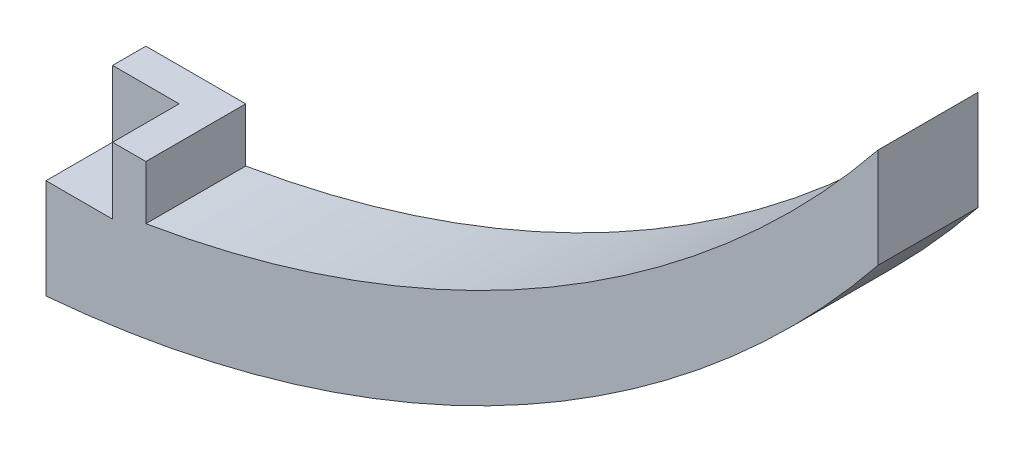
ISO-10303-21;
HEADER;
FILE_DESCRIPTION(('STEP AP214'),'2;1');
FILE_NAME('part.step','',(''),(''),'','','');
FILE_SCHEMA(('AUTOMOTIVE_DESIGN { 1 0 10303 214 1 1 1 1 }'));
ENDSEC;
DATA;
#1=APPLICATION_CONTEXT('core data for automotive mechanical design processes');
#2=APPLICATION_PROTOCOL_DEFINITION('international standard','automotive_design',2000,#1);
#3=PRODUCT_CONTEXT('',#1,'mechanical');
#4=PRODUCT('Part','Part','',(#3));
#5=PRODUCT_RELATED_PRODUCT_CATEGORY('part','',(#4));
#6=PRODUCT_DEFINITION_FORMATION('','',#4);
#7=PRODUCT_DEFINITION_CONTEXT('part definition',#1,'design');
#8=PRODUCT_DEFINITION('design','',#6,#7);
#9=PRODUCT_DEFINITION_SHAPE('','',#8);
#10=(LENGTH_UNIT() NAMED_UNIT(*) SI_UNIT(.MILLI.,.METRE.));
#11=(NAMED_UNIT(*) PLANE_ANGLE_UNIT() SI_UNIT($,.RADIAN.));
#12=(NAMED_UNIT(*) SI_UNIT($,.STERADIAN.) SOLID_ANGLE_UNIT());
#13=UNCERTAINTY_MEASURE_WITH_UNIT(LENGTH_MEASURE(1.E-05),#10,'distance_accuracy_value','');
#14=(GEOMETRIC_REPRESENTATION_CONTEXT(3) GLOBAL_UNCERTAINTY_ASSIGNED_CONTEXT((#13)) GLOBAL_UNIT_ASSIGNED_CONTEXT((#10,
#11,#12)) REPRESENTATION_CONTEXT('',''));
#15=CARTESIAN_POINT('',(0.,0.,0.));
#16=DIRECTION('',(0.,0.,1.));
#17=DIRECTION('',(1.,0.,0.));
#18=AXIS2_PLACEMENT_3D('',#15,#16,#17);
#19=CARTESIAN_POINT('',(-30.2937484008937,388.399250917739,30.));
#20=DIRECTION('',(0.,0.,1.));
#21=DIRECTION('',(-1.,0.,0.));
#22=AXIS2_PLACEMENT_3D('',#19,#20,#21);
#23=CYLINDRICAL_SURFACE('',#22,359.677264016747);
#24=DIRECTION('',(0.,0.,1.));
#25=VECTOR('',#24,1.);
#26=CARTESIAN_POINT('',(30.,33.8116056812716,29.9999999999999));
#27=LINE('',#26,#25);
#28=CARTESIAN_POINT('',(30.,33.8116056812716,30.));
#29=VERTEX_POINT('',#28);
#30=CARTESIAN_POINT('',(30.,33.8116056812717,60.));
#31=VERTEX_POINT('',#30);
#32=EDGE_CURVE('E118',#29,#31,#27,.T.);
#33=ORIENTED_EDGE('',*,*,#32,.T.);
#34=CARTESIAN_POINT('',(-30.2937484008937,388.399250917739,60.));
#35=DIRECTION('',(0.,0.,-1.));
#36=DIRECTION('',(1.,0.,0.));
#37=AXIS2_PLACEMENT_3D('',#34,#35,#36);
#38=CIRCLE('',#37,359.677264016747);
#39=CARTESIAN_POINT('',(250.,163.003712235294,60.));
#40=VERTEX_POINT('',#39);
#41=EDGE_CURVE('E162',#40,#31,#38,.T.);
#42=ORIENTED_EDGE('',*,*,#41,.F.);
#43=DIRECTION('',(0.,0.,1.));
#44=VECTOR('',#43,1.);
#45=CARTESIAN_POINT('',(250.,163.003712235294,30.));
#46=LINE('',#45,#44);
#47=CARTESIAN_POINT('',(250.,163.003712235294,30.));
#48=VERTEX_POINT('',#47);
#49=EDGE_CURVE('E167',#48,#40,#46,.T.);
#50=ORIENTED_EDGE('',*,*,#49,.F.);
#51=CARTESIAN_POINT('',(-30.2937484008937,388.399250917739,30.));
#52=DIRECTION('',(0.,0.,-1.));
#53=DIRECTION('',(1.,0.,0.));
#54=AXIS2_PLACEMENT_3D('',#51,#52,#53);
#55=CIRCLE('',#54,359.677264016747);
#56=EDGE_CURVE('E154',#48,#29,#55,.T.);
#57=ORIENTED_EDGE('',*,*,#56,.T.);
#58=EDGE_LOOP('',(#33,#42,#50,#57));
#59=FACE_BOUND('',#58,.T.);
#60=ADVANCED_FACE('F35',(#59),#23,.F.);
#61=CARTESIAN_POINT('',(-30.2937484008937,358.399250917739,60.));
#62=DIRECTION('',(0.,0.,-1.));
#63=DIRECTION('',(1.,0.,0.));
#64=AXIS2_PLACEMENT_3D('',#61,#62,#63);
#65=PLANE('',#64);
#66=DIRECTION('',(0.,-1.,0.));
#67=VECTOR('',#66,1.);
#68=CARTESIAN_POINT('',(20.,358.399250917739,60.));
#69=LINE('',#68,#67);
#70=CARTESIAN_POINT('',(20.,50.,60.0000000000001));
#71=VERTEX_POINT('',#70);
#72=CARTESIAN_POINT('',(20.,30.,60.));
#73=VERTEX_POINT('',#72);
#74=EDGE_CURVE('E11',#71,#73,#69,.T.);
#75=ORIENTED_EDGE('',*,*,#74,.T.);
#76=DIRECTION('',(-1.,0.,0.));
#77=VECTOR('',#76,1.);
#78=CARTESIAN_POINT('',(20.,30.,60.));
#79=LINE('',#78,#77);
#80=CARTESIAN_POINT('',(0.,30.,60.));
#81=VERTEX_POINT('',#80);
#82=EDGE_CURVE('E133',#73,#81,#79,.T.);
#83=ORIENTED_EDGE('',*,*,#82,.T.);
#84=DIRECTION('',(0.,-1.,0.));
#85=VECTOR('',#84,1.);
#86=CARTESIAN_POINT('',(0.,0.,60.));
#87=LINE('',#86,#85);
#88=CARTESIAN_POINT('',(0.,0.,60.));
#89=VERTEX_POINT('',#88);
#90=EDGE_CURVE('E152',#81,#89,#87,.T.);
#91=ORIENTED_EDGE('',*,*,#90,.T.);
#92=CARTESIAN_POINT('',(-30.2937484008937,358.399250917739,60.));
#93=DIRECTION('',(0.,0.,1.));
#94=DIRECTION('',(1.,0.,0.));
#95=AXIS2_PLACEMENT_3D('',#92,#93,#94);
#96=CIRCLE('',#95,359.677264016747);
#97=CARTESIAN_POINT('',(250.,133.003712235294,60.));
#98=VERTEX_POINT('',#97);
#99=EDGE_CURVE('E147',#89,#98,#96,.T.);
#100=ORIENTED_EDGE('',*,*,#99,.T.);
#101=DIRECTION('',(0.,1.,0.));
#102=VECTOR('',#101,1.);
#103=CARTESIAN_POINT('',(250.,133.003712235294,60.));
#104=LINE('',#103,#102);
#105=EDGE_CURVE('E160',#98,#40,#104,.T.);
#106=ORIENTED_EDGE('',*,*,#105,.T.);
#107=ORIENTED_EDGE('',*,*,#41,.T.);
#108=DIRECTION('',(0.,-1.,0.));
#109=VECTOR('',#108,1.);
#110=CARTESIAN_POINT('',(30.,50.,60.));
#111=LINE('',#110,#109);
#112=CARTESIAN_POINT('',(30.,50.,60.));
#113=VERTEX_POINT('',#112);
#114=EDGE_CURVE('E50',#113,#31,#111,.T.);
#115=ORIENTED_EDGE('',*,*,#114,.F.);
#116=DIRECTION('',(-1.,0.,0.));
#117=VECTOR('',#116,1.);
#118=CARTESIAN_POINT('',(30.,50.,60.));
#119=LINE('',#118,#117);
#120=EDGE_CURVE('E114',#113,#71,#119,.T.);
#121=ORIENTED_EDGE('',*,*,#120,.T.);
#122=EDGE_LOOP('',(#75,#83,#91,#100,#106,#107,#115,#121));
#123=FACE_BOUND('',#122,.T.);
#124=ADVANCED_FACE('F179',(#123),#65,.F.);
#125=CARTESIAN_POINT('',(-30.2937484008937,358.399250917739,30.));
#126=DIRECTION('',(0.,0.,1.));
#127=DIRECTION('',(-1.,0.,0.));
#128=AXIS2_PLACEMENT_3D('',#125,#126,#127);
#129=CYLINDRICAL_SURFACE('',#128,359.677264016747);
#130=ORIENTED_EDGE('',*,*,#99,.F.);
#131=DIRECTION('',(0.,0.,1.));
#132=VECTOR('',#131,1.);
#133=CARTESIAN_POINT('',(0.,0.,30.));
#134=LINE('',#133,#132);
#135=CARTESIAN_POINT('',(0.,0.,30.));
#136=VERTEX_POINT('',#135);
#137=EDGE_CURVE('E157',#136,#89,#134,.T.);
#138=ORIENTED_EDGE('',*,*,#137,.F.);
#139=CARTESIAN_POINT('',(-30.2937484008937,358.399250917739,30.));
#140=DIRECTION('',(0.,0.,1.));
#141=DIRECTION('',(1.,0.,0.));
#142=AXIS2_PLACEMENT_3D('',#139,#140,#141);
#143=CIRCLE('',#142,359.677264016747);
#144=CARTESIAN_POINT('',(250.,133.003712235294,30.));
#145=VERTEX_POINT('',#144);
#146=EDGE_CURVE('E148',#136,#145,#143,.T.);
#147=ORIENTED_EDGE('',*,*,#146,.T.);
#148=DIRECTION('',(0.,0.,1.));
#149=VECTOR('',#148,1.);
#150=CARTESIAN_POINT('',(250.,133.003712235294,30.));
#151=LINE('',#150,#149);
#152=EDGE_CURVE('E43',#145,#98,#151,.T.);
#153=ORIENTED_EDGE('',*,*,#152,.T.);
#154=EDGE_LOOP('',(#130,#138,#147,#153));
#155=FACE_BOUND('',#154,.T.);
#156=ADVANCED_FACE('F37',(#155),#129,.T.);
#157=CARTESIAN_POINT('',(250.,133.003712235294,30.));
#158=DIRECTION('',(-1.,0.,0.));
#159=DIRECTION('',(0.,0.,-1.));
#160=AXIS2_PLACEMENT_3D('',#157,#158,#159);
#161=PLANE('',#160);
#162=ORIENTED_EDGE('',*,*,#105,.F.);
#163=ORIENTED_EDGE('',*,*,#152,.F.);
#164=DIRECTION('',(0.,1.,0.));
#165=VECTOR('',#164,1.);
#166=CARTESIAN_POINT('',(250.,133.003712235294,30.));
#167=LINE('',#166,#165);
#168=EDGE_CURVE('E151',#145,#48,#167,.T.);
#169=ORIENTED_EDGE('',*,*,#168,.T.);
#170=ORIENTED_EDGE('',*,*,#49,.T.);
#171=EDGE_LOOP('',(#162,#163,#169,#170));
#172=FACE_BOUND('',#171,.T.);
#173=ADVANCED_FACE('F175',(#172),#161,.F.);
#174=CARTESIAN_POINT('',(0.,0.,30.));
#175=DIRECTION('',(1.,0.,0.));
#176=DIRECTION('',(0.,0.,1.));
#177=AXIS2_PLACEMENT_3D('',#174,#175,#176);
#178=PLANE('',#177);
#179=ORIENTED_EDGE('',*,*,#90,.F.);
#180=DIRECTION('',(0.,0.,-1.));
#181=VECTOR('',#180,1.);
#182=CARTESIAN_POINT('',(0.,30.,60.));
#183=LINE('',#182,#181);
#184=CARTESIAN_POINT('',(0.,30.,40.));
#185=VERTEX_POINT('',#184);
#186=EDGE_CURVE('E136',#81,#185,#183,.T.);
#187=ORIENTED_EDGE('',*,*,#186,.T.);
#188=DIRECTION('',(0.,-1.,0.));
#189=VECTOR('',#188,1.);
#190=CARTESIAN_POINT('',(0.,30.,40.));
#191=LINE('',#190,#189);
#192=CARTESIAN_POINT('',(0.,50.,40.));
#193=VERTEX_POINT('',#192);
#194=EDGE_CURVE('E126',#193,#185,#191,.T.);
#195=ORIENTED_EDGE('',*,*,#194,.F.);
#196=DIRECTION('',(0.,0.,-1.));
#197=VECTOR('',#196,1.);
#198=CARTESIAN_POINT('',(0.,50.,40.));
#199=LINE('',#198,#197);
#200=CARTESIAN_POINT('',(0.,50.,30.));
#201=VERTEX_POINT('',#200);
#202=EDGE_CURVE('E131',#193,#201,#199,.T.);
#203=ORIENTED_EDGE('',*,*,#202,.T.);
#204=DIRECTION('',(0.,-1.,0.));
#205=VECTOR('',#204,1.);
#206=CARTESIAN_POINT('',(0.,0.,30.));
#207=LINE('',#206,#205);
#208=EDGE_CURVE('E122',#201,#136,#207,.T.);
#209=ORIENTED_EDGE('',*,*,#208,.T.);
#210=ORIENTED_EDGE('',*,*,#137,.T.);
#211=EDGE_LOOP('',(#179,#187,#195,#203,#209,#210));
#212=FACE_BOUND('',#211,.T.);
#213=ADVANCED_FACE('F183',(#212),#178,.F.);
#214=CARTESIAN_POINT('',(-30.2937484008937,358.399250917739,30.));
#215=DIRECTION('',(0.,0.,-1.));
#216=DIRECTION('',(1.,0.,0.));
#217=AXIS2_PLACEMENT_3D('',#214,#215,#216);
#218=PLANE('',#217);
#219=ORIENTED_EDGE('',*,*,#56,.F.);
#220=ORIENTED_EDGE('',*,*,#168,.F.);
#221=ORIENTED_EDGE('',*,*,#146,.F.);
#222=ORIENTED_EDGE('',*,*,#208,.F.);
#223=DIRECTION('',(-1.,0.,0.));
#224=VECTOR('',#223,1.);
#225=CARTESIAN_POINT('',(0.,50.,30.));
#226=LINE('',#225,#224);
#227=CARTESIAN_POINT('',(30.,50.,30.));
#228=VERTEX_POINT('',#227);
#229=EDGE_CURVE('E111',#228,#201,#226,.T.);
#230=ORIENTED_EDGE('',*,*,#229,.F.);
#231=DIRECTION('',(0.,1.,0.));
#232=VECTOR('',#231,1.);
#233=CARTESIAN_POINT('',(30.,32.2556378592416,30.));
#234=LINE('',#233,#232);
#235=EDGE_CURVE('E58',#29,#228,#234,.T.);
#236=ORIENTED_EDGE('',*,*,#235,.F.);
#237=EDGE_LOOP('',(#219,#220,#221,#222,#230,#236));
#238=FACE_BOUND('',#237,.T.);
#239=ADVANCED_FACE('F120',(#238),#218,.T.);
#240=CARTESIAN_POINT('',(0.,40.,40.));
#241=DIRECTION('',(0.,0.,1.));
#242=DIRECTION('',(-1.,0.,0.));
#243=AXIS2_PLACEMENT_3D('',#240,#241,#242);
#244=PLANE('',#243);
#245=DIRECTION('',(1.,0.,0.));
#246=VECTOR('',#245,1.);
#247=CARTESIAN_POINT('',(0.,30.,40.));
#248=LINE('',#247,#246);
#249=CARTESIAN_POINT('',(20.,30.,40.));
#250=VERTEX_POINT('',#249);
#251=EDGE_CURVE('E139',#185,#250,#248,.T.);
#252=ORIENTED_EDGE('',*,*,#251,.T.);
#253=DIRECTION('',(0.,-1.,0.));
#254=VECTOR('',#253,1.);
#255=CARTESIAN_POINT('',(20.,40.,40.));
#256=LINE('',#255,#254);
#257=CARTESIAN_POINT('',(20.,50.,40.));
#258=VERTEX_POINT('',#257);
#259=EDGE_CURVE('E144',#258,#250,#256,.T.);
#260=ORIENTED_EDGE('',*,*,#259,.F.);
#261=DIRECTION('',(-1.,0.,0.));
#262=VECTOR('',#261,1.);
#263=CARTESIAN_POINT('',(0.,50.,40.));
#264=LINE('',#263,#262);
#265=EDGE_CURVE('E124',#258,#193,#264,.T.);
#266=ORIENTED_EDGE('',*,*,#265,.T.);
#267=ORIENTED_EDGE('',*,*,#194,.T.);
#268=EDGE_LOOP('',(#252,#260,#266,#267));
#269=FACE_BOUND('',#268,.T.);
#270=ADVANCED_FACE('F199',(#269),#244,.T.);
#271=CARTESIAN_POINT('',(20.,40.,40.));
#272=DIRECTION('',(-1.,0.,0.));
#273=DIRECTION('',(0.,0.,-1.));
#274=AXIS2_PLACEMENT_3D('',#271,#272,#273);
#275=PLANE('',#274);
#276=ORIENTED_EDGE('',*,*,#259,.T.);
#277=DIRECTION('',(0.,0.,1.));
#278=VECTOR('',#277,1.);
#279=CARTESIAN_POINT('',(20.,30.,40.));
#280=LINE('',#279,#278);
#281=EDGE_CURVE('E142',#250,#73,#280,.T.);
#282=ORIENTED_EDGE('',*,*,#281,.T.);
#283=ORIENTED_EDGE('',*,*,#74,.F.);
#284=DIRECTION('',(0.,0.,1.));
#285=VECTOR('',#284,1.);
#286=CARTESIAN_POINT('',(20.,50.,30.));
#287=LINE('',#286,#285);
#288=EDGE_CURVE('E187',#258,#71,#287,.T.);
#289=ORIENTED_EDGE('',*,*,#288,.F.);
#290=EDGE_LOOP('',(#276,#282,#283,#289));
#291=FACE_BOUND('',#290,.T.);
#292=ADVANCED_FACE('F194',(#291),#275,.T.);
#293=CARTESIAN_POINT('',(0.,30.,60.));
#294=DIRECTION('',(0.,1.,0.));
#295=DIRECTION('',(0.,0.,-1.));
#296=AXIS2_PLACEMENT_3D('',#293,#294,#295);
#297=PLANE('',#296);
#298=ORIENTED_EDGE('',*,*,#82,.F.);
#299=ORIENTED_EDGE('',*,*,#281,.F.);
#300=ORIENTED_EDGE('',*,*,#251,.F.);
#301=ORIENTED_EDGE('',*,*,#186,.F.);
#302=EDGE_LOOP('',(#298,#299,#300,#301));
#303=FACE_BOUND('',#302,.T.);
#304=ADVANCED_FACE('F196',(#303),#297,.T.);
#305=CARTESIAN_POINT('',(0.,50.,40.));
#306=DIRECTION('',(0.,1.,0.));
#307=DIRECTION('',(0.,0.,-1.));
#308=AXIS2_PLACEMENT_3D('',#305,#306,#307);
#309=PLANE('',#308);
#310=ORIENTED_EDGE('',*,*,#229,.T.);
#311=ORIENTED_EDGE('',*,*,#202,.F.);
#312=ORIENTED_EDGE('',*,*,#265,.F.);
#313=ORIENTED_EDGE('',*,*,#288,.T.);
#314=ORIENTED_EDGE('',*,*,#120,.F.);
#315=DIRECTION('',(0.,0.,1.));
#316=VECTOR('',#315,1.);
#317=CARTESIAN_POINT('',(30.,50.,30.));
#318=LINE('',#317,#316);
#319=EDGE_CURVE('E108',#228,#113,#318,.T.);
#320=ORIENTED_EDGE('',*,*,#319,.F.);
#321=EDGE_LOOP('',(#310,#311,#312,#313,#314,#320));
#322=FACE_BOUND('',#321,.T.);
#323=ADVANCED_FACE('F109',(#322),#309,.T.);
#324=CARTESIAN_POINT('',(30.,0.,60.));
#325=DIRECTION('',(-1.,0.,0.));
#326=DIRECTION('',(0.,0.,-1.));
#327=AXIS2_PLACEMENT_3D('',#324,#325,#326);
#328=PLANE('',#327);
#329=ORIENTED_EDGE('',*,*,#235,.T.);
#330=ORIENTED_EDGE('',*,*,#319,.T.);
#331=ORIENTED_EDGE('',*,*,#114,.T.);
#332=ORIENTED_EDGE('',*,*,#32,.F.);
#333=EDGE_LOOP('',(#329,#330,#331,#332));
#334=FACE_BOUND('',#333,.T.);
#335=ADVANCED_FACE('F116',(#334),#328,.F.);
#336=CLOSED_SHELL('',(#60,#124,#156,#173,#213,#239,#270,#292,#304,#323,#335));
#337=MANIFOLD_SOLID_BREP('B2',#336);
#338=ADVANCED_BREP_SHAPE_REPRESENTATION('',(#18,#337),#14);
#339=SHAPE_DEFINITION_REPRESENTATION(#9,#338);
ENDSEC;
END-ISO-10303-21;
